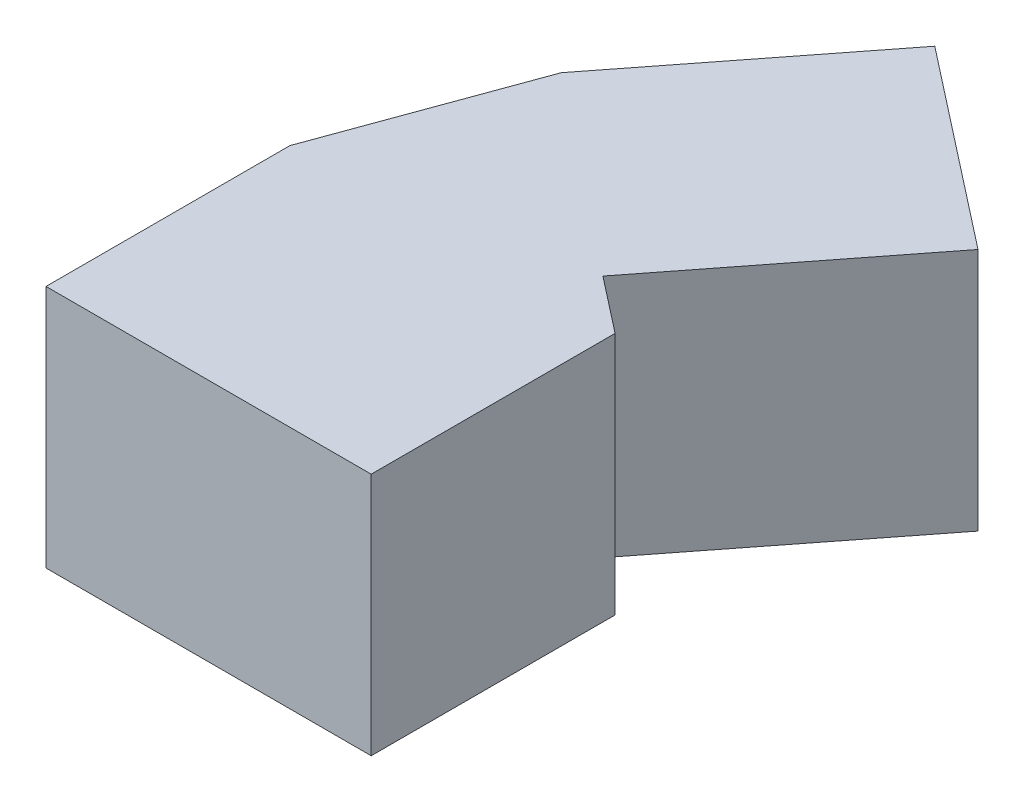
ISO-10303-21;
HEADER;
FILE_DESCRIPTION(('STEP AP214'),'2;1');
FILE_NAME('part.step','',(''),(''),'','','');
FILE_SCHEMA(('AUTOMOTIVE_DESIGN { 1 0 10303 214 1 1 1 1 }'));
ENDSEC;
DATA;
#1=APPLICATION_CONTEXT('core data for automotive mechanical design processes');
#2=APPLICATION_PROTOCOL_DEFINITION('international standard','automotive_design',2000,#1);
#3=PRODUCT_CONTEXT('',#1,'mechanical');
#4=PRODUCT('Part','Part','',(#3));
#5=PRODUCT_RELATED_PRODUCT_CATEGORY('part','',(#4));
#6=PRODUCT_DEFINITION_FORMATION('','',#4);
#7=PRODUCT_DEFINITION_CONTEXT('part definition',#1,'design');
#8=PRODUCT_DEFINITION('design','',#6,#7);
#9=PRODUCT_DEFINITION_SHAPE('','',#8);
#10=(LENGTH_UNIT() NAMED_UNIT(*) SI_UNIT(.MILLI.,.METRE.));
#11=(NAMED_UNIT(*) PLANE_ANGLE_UNIT() SI_UNIT($,.RADIAN.));
#12=(NAMED_UNIT(*) SI_UNIT($,.STERADIAN.) SOLID_ANGLE_UNIT());
#13=UNCERTAINTY_MEASURE_WITH_UNIT(LENGTH_MEASURE(1.E-05),#10,'distance_accuracy_value','');
#14=(GEOMETRIC_REPRESENTATION_CONTEXT(3) GLOBAL_UNCERTAINTY_ASSIGNED_CONTEXT((#13)) GLOBAL_UNIT_ASSIGNED_CONTEXT((#10,
#11,#12)) REPRESENTATION_CONTEXT('',''));
#15=CARTESIAN_POINT('',(0.,0.,0.));
#16=DIRECTION('',(0.,0.,1.));
#17=DIRECTION('',(1.,0.,0.));
#18=AXIS2_PLACEMENT_3D('',#15,#16,#17);
#19=CARTESIAN_POINT('',(0.,18.,0.));
#20=DIRECTION('',(1.,0.,0.));
#21=DIRECTION('',(0.,0.,-1.));
#22=AXIS2_PLACEMENT_3D('',#19,#20,#21);
#23=PLANE('',#22);
#24=DIRECTION('',(0.,0.,1.));
#25=VECTOR('',#24,1.);
#26=CARTESIAN_POINT('',(0.,0.,0.));
#27=LINE('',#26,#25);
#28=CARTESIAN_POINT('',(0.,0.,-18.));
#29=VERTEX_POINT('',#28);
#30=CARTESIAN_POINT('',(0.,0.,0.));
#31=VERTEX_POINT('',#30);
#32=EDGE_CURVE('E131',#29,#31,#27,.T.);
#33=ORIENTED_EDGE('',*,*,#32,.T.);
#34=DIRECTION('',(0.,-1.,0.));
#35=VECTOR('',#34,1.);
#36=CARTESIAN_POINT('',(0.,18.,0.));
#37=LINE('',#36,#35);
#38=CARTESIAN_POINT('',(0.,18.,0.));
#39=VERTEX_POINT('',#38);
#40=EDGE_CURVE('E11',#39,#31,#37,.T.);
#41=ORIENTED_EDGE('',*,*,#40,.F.);
#42=DIRECTION('',(0.,0.,1.));
#43=VECTOR('',#42,1.);
#44=CARTESIAN_POINT('',(0.,18.,0.));
#45=LINE('',#44,#43);
#46=CARTESIAN_POINT('',(0.,18.,-18.));
#47=VERTEX_POINT('',#46);
#48=EDGE_CURVE('E145',#47,#39,#45,.T.);
#49=ORIENTED_EDGE('',*,*,#48,.F.);
#50=DIRECTION('',(0.,-1.,0.));
#51=VECTOR('',#50,1.);
#52=CARTESIAN_POINT('',(0.,18.,-18.));
#53=LINE('',#52,#51);
#54=EDGE_CURVE('E127',#47,#29,#53,.T.);
#55=ORIENTED_EDGE('',*,*,#54,.T.);
#56=EDGE_LOOP('',(#33,#41,#49,#55));
#57=FACE_BOUND('',#56,.T.);
#58=ADVANCED_FACE('F35',(#57),#23,.F.);
#59=CARTESIAN_POINT('',(0.,18.,0.));
#60=DIRECTION('',(0.,0.,-1.));
#61=DIRECTION('',(-1.,0.,0.));
#62=AXIS2_PLACEMENT_3D('',#59,#60,#61);
#63=PLANE('',#62);
#64=DIRECTION('',(1.,0.,0.));
#65=VECTOR('',#64,1.);
#66=CARTESIAN_POINT('',(0.,0.,0.));
#67=LINE('',#66,#65);
#68=CARTESIAN_POINT('',(24.,0.,0.));
#69=VERTEX_POINT('',#68);
#70=EDGE_CURVE('E134',#31,#69,#67,.T.);
#71=ORIENTED_EDGE('',*,*,#70,.T.);
#72=DIRECTION('',(0.,-1.,0.));
#73=VECTOR('',#72,1.);
#74=CARTESIAN_POINT('',(24.,18.,0.));
#75=LINE('',#74,#73);
#76=CARTESIAN_POINT('',(24.,18.,0.));
#77=VERTEX_POINT('',#76);
#78=EDGE_CURVE('E43',#77,#69,#75,.T.);
#79=ORIENTED_EDGE('',*,*,#78,.F.);
#80=DIRECTION('',(1.,0.,0.));
#81=VECTOR('',#80,1.);
#82=CARTESIAN_POINT('',(0.,18.,0.));
#83=LINE('',#82,#81);
#84=EDGE_CURVE('E94',#39,#77,#83,.T.);
#85=ORIENTED_EDGE('',*,*,#84,.F.);
#86=ORIENTED_EDGE('',*,*,#40,.T.);
#87=EDGE_LOOP('',(#71,#79,#85,#86));
#88=FACE_BOUND('',#87,.T.);
#89=ADVANCED_FACE('F180',(#88),#63,.F.);
#90=CARTESIAN_POINT('',(24.,18.,0.));
#91=DIRECTION('',(-1.,0.,0.));
#92=DIRECTION('',(0.,0.,1.));
#93=AXIS2_PLACEMENT_3D('',#90,#91,#92);
#94=PLANE('',#93);
#95=DIRECTION('',(0.,0.,-1.));
#96=VECTOR('',#95,1.);
#97=CARTESIAN_POINT('',(24.,0.,0.));
#98=LINE('',#97,#96);
#99=CARTESIAN_POINT('',(24.,0.,-18.));
#100=VERTEX_POINT('',#99);
#101=EDGE_CURVE('E136',#69,#100,#98,.T.);
#102=ORIENTED_EDGE('',*,*,#101,.T.);
#103=DIRECTION('',(0.,-1.,0.));
#104=VECTOR('',#103,1.);
#105=CARTESIAN_POINT('',(24.,18.,-18.));
#106=LINE('',#105,#104);
#107=CARTESIAN_POINT('',(24.,18.,-18.));
#108=VERTEX_POINT('',#107);
#109=EDGE_CURVE('E152',#108,#100,#106,.T.);
#110=ORIENTED_EDGE('',*,*,#109,.F.);
#111=DIRECTION('',(0.,0.,-1.));
#112=VECTOR('',#111,1.);
#113=CARTESIAN_POINT('',(24.,18.,0.));
#114=LINE('',#113,#112);
#115=EDGE_CURVE('E160',#77,#108,#114,.T.);
#116=ORIENTED_EDGE('',*,*,#115,.F.);
#117=ORIENTED_EDGE('',*,*,#78,.T.);
#118=EDGE_LOOP('',(#102,#110,#116,#117));
#119=FACE_BOUND('',#118,.T.);
#120=ADVANCED_FACE('F158',(#119),#94,.F.);
#121=CARTESIAN_POINT('',(19.8879804436021,18.,-21.2126617753283));
#122=DIRECTION('',(-0.615661475325662,0.,0.788010753606719));
#123=DIRECTION('',(0.788010753606719,0.,0.615661475325662));
#124=AXIS2_PLACEMENT_3D('',#121,#122,#123);
#125=PLANE('',#124);
#126=DIRECTION('',(-0.788010753606719,0.,-0.615661475325662));
#127=VECTOR('',#126,1.);
#128=CARTESIAN_POINT('',(19.8879804436021,0.,-21.2126617753283));
#129=LINE('',#128,#127);
#130=CARTESIAN_POINT('',(19.8879804436021,0.,-21.2126617753283));
#131=VERTEX_POINT('',#130);
#132=EDGE_CURVE('E138',#100,#131,#129,.T.);
#133=ORIENTED_EDGE('',*,*,#132,.T.);
#134=DIRECTION('',(0.,-1.,0.));
#135=VECTOR('',#134,1.);
#136=CARTESIAN_POINT('',(19.8879804436021,18.,-21.2126617753283));
#137=LINE('',#136,#135);
#138=CARTESIAN_POINT('',(19.8879804436021,18.,-21.2126617753283));
#139=VERTEX_POINT('',#138);
#140=EDGE_CURVE('E149',#139,#131,#137,.T.);
#141=ORIENTED_EDGE('',*,*,#140,.F.);
#142=DIRECTION('',(-0.788010753606719,0.,-0.615661475325662));
#143=VECTOR('',#142,1.);
#144=CARTESIAN_POINT('',(19.8879804436021,18.,-21.2126617753283));
#145=LINE('',#144,#143);
#146=EDGE_CURVE('E172',#108,#139,#145,.T.);
#147=ORIENTED_EDGE('',*,*,#146,.F.);
#148=ORIENTED_EDGE('',*,*,#109,.T.);
#149=EDGE_LOOP('',(#133,#141,#147,#148));
#150=FACE_BOUND('',#149,.T.);
#151=ADVANCED_FACE('F168',(#150),#125,.F.);
#152=CARTESIAN_POINT('',(32.0301459569934,18.,-36.7539249208966));
#153=DIRECTION('',(-0.788010753606719,0.,-0.615661475325662));
#154=DIRECTION('',(-0.615661475325662,0.,0.788010753606719));
#155=AXIS2_PLACEMENT_3D('',#152,#153,#154);
#156=PLANE('',#155);
#157=DIRECTION('',(0.615661475325662,0.,-0.788010753606719));
#158=VECTOR('',#157,1.);
#159=CARTESIAN_POINT('',(32.0301459569934,0.,-36.7539249208966));
#160=LINE('',#159,#158);
#161=CARTESIAN_POINT('',(32.0301459569934,0.,-36.7539249208966));
#162=VERTEX_POINT('',#161);
#163=EDGE_CURVE('E140',#131,#162,#160,.T.);
#164=ORIENTED_EDGE('',*,*,#163,.T.);
#165=DIRECTION('',(0.,-1.,0.));
#166=VECTOR('',#165,1.);
#167=CARTESIAN_POINT('',(32.0301459569934,18.,-36.7539249208966));
#168=LINE('',#167,#166);
#169=CARTESIAN_POINT('',(32.0301459569934,18.,-36.7539249208966));
#170=VERTEX_POINT('',#169);
#171=EDGE_CURVE('E122',#170,#162,#168,.T.);
#172=ORIENTED_EDGE('',*,*,#171,.F.);
#173=DIRECTION('',(0.615661475325662,0.,-0.788010753606719));
#174=VECTOR('',#173,1.);
#175=CARTESIAN_POINT('',(32.0301459569934,18.,-36.7539249208966));
#176=LINE('',#175,#174);
#177=EDGE_CURVE('E113',#139,#170,#176,.T.);
#178=ORIENTED_EDGE('',*,*,#177,.F.);
#179=ORIENTED_EDGE('',*,*,#140,.T.);
#180=EDGE_LOOP('',(#164,#172,#178,#179));
#181=FACE_BOUND('',#180,.T.);
#182=ADVANCED_FACE('F171',(#181),#156,.F.);
#183=CARTESIAN_POINT('',(17.4435301812081,18.,-48.1502381658939));
#184=DIRECTION('',(-0.615661475325662,0.,0.788010753606719));
#185=DIRECTION('',(0.788010753606719,0.,0.615661475325662));
#186=AXIS2_PLACEMENT_3D('',#183,#184,#185);
#187=PLANE('',#186);
#188=DIRECTION('',(-0.788010753606719,0.,-0.615661475325662));
#189=VECTOR('',#188,1.);
#190=CARTESIAN_POINT('',(17.4435301812081,0.,-48.1502381658939));
#191=LINE('',#190,#189);
#192=CARTESIAN_POINT('',(17.4435301812081,0.,-48.1502381658939));
#193=VERTEX_POINT('',#192);
#194=EDGE_CURVE('E121',#162,#193,#191,.T.);
#195=ORIENTED_EDGE('',*,*,#194,.T.);
#196=DIRECTION('',(0.,-1.,0.));
#197=VECTOR('',#196,1.);
#198=CARTESIAN_POINT('',(17.4435301812081,18.,-48.1502381658939));
#199=LINE('',#198,#197);
#200=CARTESIAN_POINT('',(17.4435301812081,18.,-48.1502381658939));
#201=VERTEX_POINT('',#200);
#202=EDGE_CURVE('E118',#201,#193,#199,.T.);
#203=ORIENTED_EDGE('',*,*,#202,.F.);
#204=DIRECTION('',(-0.788010753606719,0.,-0.615661475325662));
#205=VECTOR('',#204,1.);
#206=CARTESIAN_POINT('',(17.4435301812081,18.,-48.1502381658939));
#207=LINE('',#206,#205);
#208=EDGE_CURVE('E107',#170,#201,#207,.T.);
#209=ORIENTED_EDGE('',*,*,#208,.F.);
#210=ORIENTED_EDGE('',*,*,#171,.T.);
#211=EDGE_LOOP('',(#195,#203,#209,#210));
#212=FACE_BOUND('',#211,.T.);
#213=ADVANCED_FACE('F119',(#212),#187,.F.);
#214=CARTESIAN_POINT('',(5.35469328558769,18.,-32.6772325383978));
#215=DIRECTION('',(0.788010753606719,0.,0.615661475325662));
#216=DIRECTION('',(0.615661475325662,0.,-0.788010753606719));
#217=AXIS2_PLACEMENT_3D('',#214,#215,#216);
#218=PLANE('',#217);
#219=DIRECTION('',(-0.615661475325662,0.,0.788010753606719));
#220=VECTOR('',#219,1.);
#221=CARTESIAN_POINT('',(5.35469328558769,0.,-32.6772325383978));
#222=LINE('',#221,#220);
#223=CARTESIAN_POINT('',(5.35469328558769,0.,-32.6772325383978));
#224=VERTEX_POINT('',#223);
#225=EDGE_CURVE('E80',#193,#224,#222,.T.);
#226=ORIENTED_EDGE('',*,*,#225,.T.);
#227=DIRECTION('',(0.,-1.,0.));
#228=VECTOR('',#227,1.);
#229=CARTESIAN_POINT('',(5.35469328558769,18.,-32.6772325383978));
#230=LINE('',#229,#228);
#231=CARTESIAN_POINT('',(5.35469328558769,18.,-32.6772325383978));
#232=VERTEX_POINT('',#231);
#233=EDGE_CURVE('E123',#232,#224,#230,.T.);
#234=ORIENTED_EDGE('',*,*,#233,.F.);
#235=DIRECTION('',(-0.615661475325662,0.,0.788010753606719));
#236=VECTOR('',#235,1.);
#237=CARTESIAN_POINT('',(5.35469328558769,18.,-32.6772325383978));
#238=LINE('',#237,#236);
#239=EDGE_CURVE('E111',#201,#232,#238,.T.);
#240=ORIENTED_EDGE('',*,*,#239,.F.);
#241=ORIENTED_EDGE('',*,*,#202,.T.);
#242=EDGE_LOOP('',(#226,#234,#240,#241));
#243=FACE_BOUND('',#242,.T.);
#244=ADVANCED_FACE('F125',(#243),#218,.F.);
#245=CARTESIAN_POINT('',(0.,18.,-18.));
#246=DIRECTION('',(0.939432793009176,0.,0.342733172335242));
#247=DIRECTION('',(0.342733172335242,0.,-0.939432793009176));
#248=AXIS2_PLACEMENT_3D('',#245,#246,#247);
#249=PLANE('',#248);
#250=DIRECTION('',(-0.342733172335242,0.,0.939432793009176));
#251=VECTOR('',#250,1.);
#252=CARTESIAN_POINT('',(0.,0.,-18.));
#253=LINE('',#252,#251);
#254=EDGE_CURVE('E86',#224,#29,#253,.T.);
#255=ORIENTED_EDGE('',*,*,#254,.T.);
#256=ORIENTED_EDGE('',*,*,#54,.F.);
#257=DIRECTION('',(-0.342733172335242,0.,0.939432793009176));
#258=VECTOR('',#257,1.);
#259=CARTESIAN_POINT('',(0.,18.,-18.));
#260=LINE('',#259,#258);
#261=EDGE_CURVE('E51',#232,#47,#260,.T.);
#262=ORIENTED_EDGE('',*,*,#261,.F.);
#263=ORIENTED_EDGE('',*,*,#233,.T.);
#264=EDGE_LOOP('',(#255,#256,#262,#263));
#265=FACE_BOUND('',#264,.T.);
#266=ADVANCED_FACE('F196',(#265),#249,.F.);
#267=CARTESIAN_POINT('',(0.,18.,0.));
#268=DIRECTION('',(0.,-1.,0.));
#269=DIRECTION('',(0.,0.,-1.));
#270=AXIS2_PLACEMENT_3D('',#267,#268,#269);
#271=PLANE('',#270);
#272=ORIENTED_EDGE('',*,*,#48,.T.);
#273=ORIENTED_EDGE('',*,*,#84,.T.);
#274=ORIENTED_EDGE('',*,*,#115,.T.);
#275=ORIENTED_EDGE('',*,*,#146,.T.);
#276=ORIENTED_EDGE('',*,*,#177,.T.);
#277=ORIENTED_EDGE('',*,*,#208,.T.);
#278=ORIENTED_EDGE('',*,*,#239,.T.);
#279=ORIENTED_EDGE('',*,*,#261,.T.);
#280=EDGE_LOOP('',(#272,#273,#274,#275,#276,#277,#278,#279));
#281=FACE_BOUND('',#280,.T.);
#282=ADVANCED_FACE('F109',(#281),#271,.F.);
#283=CARTESIAN_POINT('',(0.,0.,0.));
#284=DIRECTION('',(0.,-1.,0.));
#285=DIRECTION('',(0.,0.,-1.));
#286=AXIS2_PLACEMENT_3D('',#283,#284,#285);
#287=PLANE('',#286);
#288=ORIENTED_EDGE('',*,*,#32,.F.);
#289=ORIENTED_EDGE('',*,*,#254,.F.);
#290=ORIENTED_EDGE('',*,*,#225,.F.);
#291=ORIENTED_EDGE('',*,*,#194,.F.);
#292=ORIENTED_EDGE('',*,*,#163,.F.);
#293=ORIENTED_EDGE('',*,*,#132,.F.);
#294=ORIENTED_EDGE('',*,*,#101,.F.);
#295=ORIENTED_EDGE('',*,*,#70,.F.);
#296=EDGE_LOOP('',(#288,#289,#290,#291,#292,#293,#294,#295));
#297=FACE_BOUND('',#296,.T.);
#298=ADVANCED_FACE('F164',(#297),#287,.T.);
#299=CLOSED_SHELL('',(#58,#89,#120,#151,#182,#213,#244,#266,#282,#298));
#300=MANIFOLD_SOLID_BREP('B2',#299);
#301=ADVANCED_BREP_SHAPE_REPRESENTATION('',(#18,#300),#14);
#302=SHAPE_DEFINITION_REPRESENTATION(#9,#301);
ENDSEC;
END-ISO-10303-21;
